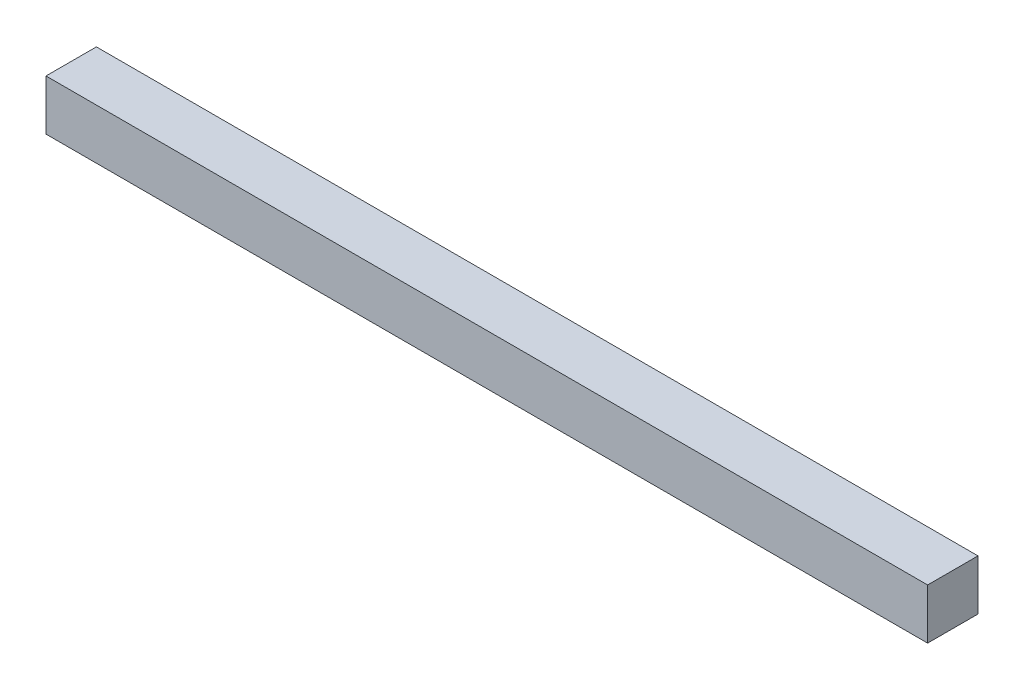
ISO-10303-21;
HEADER;
FILE_DESCRIPTION(('STEP AP214'),'2;1');
FILE_NAME('part.step','',(''),(''),'','','');
FILE_SCHEMA(('AUTOMOTIVE_DESIGN { 1 0 10303 214 1 1 1 1 }'));
ENDSEC;
DATA;
#1=APPLICATION_CONTEXT('core data for automotive mechanical design processes');
#2=APPLICATION_PROTOCOL_DEFINITION('international standard','automotive_design',2000,#1);
#3=PRODUCT_CONTEXT('',#1,'mechanical');
#4=PRODUCT('Part','Part','',(#3));
#5=PRODUCT_RELATED_PRODUCT_CATEGORY('part','',(#4));
#6=PRODUCT_DEFINITION_FORMATION('','',#4);
#7=PRODUCT_DEFINITION_CONTEXT('part definition',#1,'design');
#8=PRODUCT_DEFINITION('design','',#6,#7);
#9=PRODUCT_DEFINITION_SHAPE('','',#8);
#10=(LENGTH_UNIT() NAMED_UNIT(*) SI_UNIT(.MILLI.,.METRE.));
#11=(NAMED_UNIT(*) PLANE_ANGLE_UNIT() SI_UNIT($,.RADIAN.));
#12=(NAMED_UNIT(*) SI_UNIT($,.STERADIAN.) SOLID_ANGLE_UNIT());
#13=UNCERTAINTY_MEASURE_WITH_UNIT(LENGTH_MEASURE(1.E-05),#10,'distance_accuracy_value','');
#14=(GEOMETRIC_REPRESENTATION_CONTEXT(3) GLOBAL_UNCERTAINTY_ASSIGNED_CONTEXT((#13)) GLOBAL_UNIT_ASSIGNED_CONTEXT((#10,
#11,#12)) REPRESENTATION_CONTEXT('',''));
#15=CARTESIAN_POINT('',(0.,0.,0.));
#16=DIRECTION('',(0.,0.,1.));
#17=DIRECTION('',(1.,0.,0.));
#18=AXIS2_PLACEMENT_3D('',#15,#16,#17);
#19=CARTESIAN_POINT('',(175.,-10.,10.));
#20=DIRECTION('',(0.,0.,-1.));
#21=DIRECTION('',(-1.,0.,0.));
#22=AXIS2_PLACEMENT_3D('',#19,#20,#21);
#23=PLANE('',#22);
#24=DIRECTION('',(0.,-1.,0.));
#25=VECTOR('',#24,1.);
#26=CARTESIAN_POINT('',(-175.,-10.,10.));
#27=LINE('',#26,#25);
#28=CARTESIAN_POINT('',(-175.,10.,10.));
#29=VERTEX_POINT('',#28);
#30=CARTESIAN_POINT('',(-175.,-10.,10.));
#31=VERTEX_POINT('',#30);
#32=EDGE_CURVE('E96',#29,#31,#27,.T.);
#33=ORIENTED_EDGE('',*,*,#32,.T.);
#34=DIRECTION('',(-1.,0.,0.));
#35=VECTOR('',#34,1.);
#36=CARTESIAN_POINT('',(175.,-10.,10.));
#37=LINE('',#36,#35);
#38=CARTESIAN_POINT('',(175.,-10.,10.));
#39=VERTEX_POINT('',#38);
#40=EDGE_CURVE('E11',#39,#31,#37,.T.);
#41=ORIENTED_EDGE('',*,*,#40,.F.);
#42=DIRECTION('',(0.,-1.,0.));
#43=VECTOR('',#42,1.);
#44=CARTESIAN_POINT('',(175.,-10.,10.));
#45=LINE('',#44,#43);
#46=CARTESIAN_POINT('',(175.,10.,10.));
#47=VERTEX_POINT('',#46);
#48=EDGE_CURVE('E84',#47,#39,#45,.T.);
#49=ORIENTED_EDGE('',*,*,#48,.F.);
#50=DIRECTION('',(-1.,0.,0.));
#51=VECTOR('',#50,1.);
#52=CARTESIAN_POINT('',(175.,10.,10.));
#53=LINE('',#52,#51);
#54=EDGE_CURVE('E92',#47,#29,#53,.T.);
#55=ORIENTED_EDGE('',*,*,#54,.T.);
#56=EDGE_LOOP('',(#33,#41,#49,#55));
#57=FACE_BOUND('',#56,.T.);
#58=ADVANCED_FACE('F33',(#57),#23,.F.);
#59=CARTESIAN_POINT('',(175.,-10.,-10.));
#60=DIRECTION('',(0.,1.,0.));
#61=DIRECTION('',(0.,0.,1.));
#62=AXIS2_PLACEMENT_3D('',#59,#60,#61);
#63=PLANE('',#62);
#64=DIRECTION('',(0.,0.,-1.));
#65=VECTOR('',#64,1.);
#66=CARTESIAN_POINT('',(-175.,-10.,-10.));
#67=LINE('',#66,#65);
#68=CARTESIAN_POINT('',(-175.,-10.,-10.));
#69=VERTEX_POINT('',#68);
#70=EDGE_CURVE('E88',#31,#69,#67,.T.);
#71=ORIENTED_EDGE('',*,*,#70,.T.);
#72=DIRECTION('',(-1.,0.,0.));
#73=VECTOR('',#72,1.);
#74=CARTESIAN_POINT('',(175.,-10.,-10.));
#75=LINE('',#74,#73);
#76=CARTESIAN_POINT('',(175.,-10.,-10.));
#77=VERTEX_POINT('',#76);
#78=EDGE_CURVE('E41',#77,#69,#75,.T.);
#79=ORIENTED_EDGE('',*,*,#78,.F.);
#80=DIRECTION('',(0.,0.,-1.));
#81=VECTOR('',#80,1.);
#82=CARTESIAN_POINT('',(175.,-10.,-10.));
#83=LINE('',#82,#81);
#84=EDGE_CURVE('E79',#39,#77,#83,.T.);
#85=ORIENTED_EDGE('',*,*,#84,.F.);
#86=ORIENTED_EDGE('',*,*,#40,.T.);
#87=EDGE_LOOP('',(#71,#79,#85,#86));
#88=FACE_BOUND('',#87,.T.);
#89=ADVANCED_FACE('F87',(#88),#63,.F.);
#90=CARTESIAN_POINT('',(175.,-10.,-10.));
#91=DIRECTION('',(0.,0.,1.));
#92=DIRECTION('',(1.,0.,0.));
#93=AXIS2_PLACEMENT_3D('',#90,#91,#92);
#94=PLANE('',#93);
#95=DIRECTION('',(0.,1.,0.));
#96=VECTOR('',#95,1.);
#97=CARTESIAN_POINT('',(-175.,-10.,-10.));
#98=LINE('',#97,#96);
#99=CARTESIAN_POINT('',(-175.,10.,-10.));
#100=VERTEX_POINT('',#99);
#101=EDGE_CURVE('E66',#69,#100,#98,.T.);
#102=ORIENTED_EDGE('',*,*,#101,.T.);
#103=DIRECTION('',(-1.,0.,0.));
#104=VECTOR('',#103,1.);
#105=CARTESIAN_POINT('',(175.,10.,-10.));
#106=LINE('',#105,#104);
#107=CARTESIAN_POINT('',(175.,10.,-10.));
#108=VERTEX_POINT('',#107);
#109=EDGE_CURVE('E89',#108,#100,#106,.T.);
#110=ORIENTED_EDGE('',*,*,#109,.F.);
#111=DIRECTION('',(0.,1.,0.));
#112=VECTOR('',#111,1.);
#113=CARTESIAN_POINT('',(175.,-10.,-10.));
#114=LINE('',#113,#112);
#115=EDGE_CURVE('E82',#77,#108,#114,.T.);
#116=ORIENTED_EDGE('',*,*,#115,.F.);
#117=ORIENTED_EDGE('',*,*,#78,.T.);
#118=EDGE_LOOP('',(#102,#110,#116,#117));
#119=FACE_BOUND('',#118,.T.);
#120=ADVANCED_FACE('F90',(#119),#94,.F.);
#121=CARTESIAN_POINT('',(175.,10.,-10.));
#122=DIRECTION('',(0.,-1.,0.));
#123=DIRECTION('',(0.,0.,-1.));
#124=AXIS2_PLACEMENT_3D('',#121,#122,#123);
#125=PLANE('',#124);
#126=DIRECTION('',(0.,0.,1.));
#127=VECTOR('',#126,1.);
#128=CARTESIAN_POINT('',(-175.,10.,-10.));
#129=LINE('',#128,#127);
#130=EDGE_CURVE('E72',#100,#29,#129,.T.);
#131=ORIENTED_EDGE('',*,*,#130,.T.);
#132=ORIENTED_EDGE('',*,*,#54,.F.);
#133=DIRECTION('',(0.,0.,1.));
#134=VECTOR('',#133,1.);
#135=CARTESIAN_POINT('',(175.,10.,-10.));
#136=LINE('',#135,#134);
#137=EDGE_CURVE('E49',#108,#47,#136,.T.);
#138=ORIENTED_EDGE('',*,*,#137,.F.);
#139=ORIENTED_EDGE('',*,*,#109,.T.);
#140=EDGE_LOOP('',(#131,#132,#138,#139));
#141=FACE_BOUND('',#140,.T.);
#142=ADVANCED_FACE('F103',(#141),#125,.F.);
#143=CARTESIAN_POINT('',(175.,0.,0.));
#144=DIRECTION('',(1.,0.,0.));
#145=DIRECTION('',(0.,0.,-1.));
#146=AXIS2_PLACEMENT_3D('',#143,#144,#145);
#147=PLANE('',#146);
#148=ORIENTED_EDGE('',*,*,#48,.T.);
#149=ORIENTED_EDGE('',*,*,#84,.T.);
#150=ORIENTED_EDGE('',*,*,#115,.T.);
#151=ORIENTED_EDGE('',*,*,#137,.T.);
#152=EDGE_LOOP('',(#148,#149,#150,#151));
#153=FACE_BOUND('',#152,.T.);
#154=ADVANCED_FACE('F80',(#153),#147,.T.);
#155=CARTESIAN_POINT('',(-175.,0.,0.));
#156=DIRECTION('',(1.,0.,0.));
#157=DIRECTION('',(0.,0.,-1.));
#158=AXIS2_PLACEMENT_3D('',#155,#156,#157);
#159=PLANE('',#158);
#160=ORIENTED_EDGE('',*,*,#32,.F.);
#161=ORIENTED_EDGE('',*,*,#130,.F.);
#162=ORIENTED_EDGE('',*,*,#101,.F.);
#163=ORIENTED_EDGE('',*,*,#70,.F.);
#164=EDGE_LOOP('',(#160,#161,#162,#163));
#165=FACE_BOUND('',#164,.T.);
#166=ADVANCED_FACE('F106',(#165),#159,.F.);
#167=CLOSED_SHELL('',(#58,#89,#120,#142,#154,#166));
#168=MANIFOLD_SOLID_BREP('B2',#167);
#169=ADVANCED_BREP_SHAPE_REPRESENTATION('',(#18,#168),#14);
#170=SHAPE_DEFINITION_REPRESENTATION(#9,#169);
ENDSEC;
END-ISO-10303-21;
